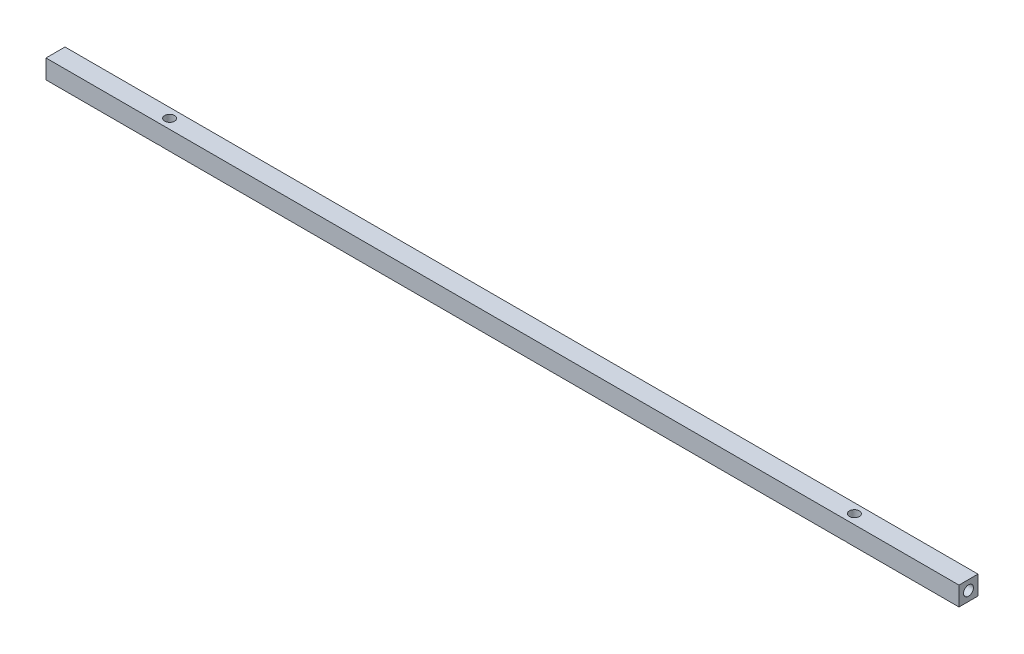
ISO-10303-21;
HEADER;
FILE_DESCRIPTION(('STEP AP214'),'2;1');
FILE_NAME('part.step','',(''),(''),'','','');
FILE_SCHEMA(('AUTOMOTIVE_DESIGN { 1 0 10303 214 1 1 1 1 }'));
ENDSEC;
DATA;
#1=APPLICATION_CONTEXT('core data for automotive mechanical design processes');
#2=APPLICATION_PROTOCOL_DEFINITION('international standard','automotive_design',2000,#1);
#3=PRODUCT_CONTEXT('',#1,'mechanical');
#4=PRODUCT('Part','Part','',(#3));
#5=PRODUCT_RELATED_PRODUCT_CATEGORY('part','',(#4));
#6=PRODUCT_DEFINITION_FORMATION('','',#4);
#7=PRODUCT_DEFINITION_CONTEXT('part definition',#1,'design');
#8=PRODUCT_DEFINITION('design','',#6,#7);
#9=PRODUCT_DEFINITION_SHAPE('','',#8);
#10=(LENGTH_UNIT() NAMED_UNIT(*) SI_UNIT(.MILLI.,.METRE.));
#11=(NAMED_UNIT(*) PLANE_ANGLE_UNIT() SI_UNIT($,.RADIAN.));
#12=(NAMED_UNIT(*) SI_UNIT($,.STERADIAN.) SOLID_ANGLE_UNIT());
#13=UNCERTAINTY_MEASURE_WITH_UNIT(LENGTH_MEASURE(1.E-05),#10,'distance_accuracy_value','');
#14=(GEOMETRIC_REPRESENTATION_CONTEXT(3) GLOBAL_UNCERTAINTY_ASSIGNED_CONTEXT((#13)) GLOBAL_UNIT_ASSIGNED_CONTEXT((#10,
#11,#12)) REPRESENTATION_CONTEXT('',''));
#15=CARTESIAN_POINT('',(0.,0.,0.));
#16=DIRECTION('',(0.,0.,1.));
#17=DIRECTION('',(1.,0.,0.));
#18=AXIS2_PLACEMENT_3D('',#15,#16,#17);
#19=CARTESIAN_POINT('',(152.4,-3.175,3.175));
#20=DIRECTION('',(0.,1.,0.));
#21=DIRECTION('',(0.,0.,1.));
#22=AXIS2_PLACEMENT_3D('',#19,#20,#21);
#23=PLANE('',#22);
#24=DIRECTION('',(-1.,0.,0.));
#25=VECTOR('',#24,1.);
#26=CARTESIAN_POINT('',(152.4,-3.175,3.175));
#27=LINE('',#26,#25);
#28=CARTESIAN_POINT('',(113.661832898059,-3.175,3.175));
#29=VERTEX_POINT('',#28);
#30=CARTESIAN_POINT('',(-113.661832898059,-3.175,3.175));
#31=VERTEX_POINT('',#30);
#32=EDGE_CURVE('E237',#29,#31,#27,.T.);
#33=ORIENTED_EDGE('',*,*,#32,.T.);
#34=CARTESIAN_POINT('',(-114.3,-3.175,0.));
#35=DIRECTION('',(0.,1.,0.));
#36=DIRECTION('',(0.,0.,1.));
#37=AXIS2_PLACEMENT_3D('',#34,#35,#36);
#38=CIRCLE('',#37,3.23850000000005);
#39=CARTESIAN_POINT('',(-113.661832898058,-3.175,-3.175));
#40=VERTEX_POINT('',#39);
#41=EDGE_CURVE('E181',#31,#40,#38,.T.);
#42=ORIENTED_EDGE('',*,*,#41,.T.);
#43=DIRECTION('',(-1.,0.,0.));
#44=VECTOR('',#43,1.);
#45=CARTESIAN_POINT('',(152.4,-3.175,-3.175));
#46=LINE('',#45,#44);
#47=CARTESIAN_POINT('',(113.661832898059,-3.175,-3.175));
#48=VERTEX_POINT('',#47);
#49=EDGE_CURVE('E249',#48,#40,#46,.T.);
#50=ORIENTED_EDGE('',*,*,#49,.F.);
#51=CARTESIAN_POINT('',(114.3,-3.175,0.));
#52=DIRECTION('',(0.,1.,0.));
#53=DIRECTION('',(0.,0.,1.));
#54=AXIS2_PLACEMENT_3D('',#51,#52,#53);
#55=CIRCLE('',#54,3.23850000000003);
#56=EDGE_CURVE('E142',#48,#29,#55,.T.);
#57=ORIENTED_EDGE('',*,*,#56,.T.);
#58=EDGE_LOOP('',(#33,#42,#50,#57));
#59=FACE_BOUND('',#58,.T.);
#60=ADVANCED_FACE('F45',(#59),#23,.F.);
#61=CARTESIAN_POINT('',(152.4,-3.175,3.175));
#62=VERTEX_POINT('',#61);
#63=CARTESIAN_POINT('',(114.938167101941,-3.175,3.175));
#64=VERTEX_POINT('',#63);
#65=EDGE_CURVE('E144',#62,#64,#27,.T.);
#66=ORIENTED_EDGE('',*,*,#65,.T.);
#67=CARTESIAN_POINT('',(114.3,-3.175,0.));
#68=DIRECTION('',(0.,1.,0.));
#69=DIRECTION('',(0.,0.,1.));
#70=AXIS2_PLACEMENT_3D('',#67,#68,#69);
#71=CIRCLE('',#70,3.23850000000003);
#72=CARTESIAN_POINT('',(114.938167101941,-3.175,-3.175));
#73=VERTEX_POINT('',#72);
#74=EDGE_CURVE('E149',#64,#73,#71,.T.);
#75=ORIENTED_EDGE('',*,*,#74,.T.);
#76=CARTESIAN_POINT('',(152.4,-3.175,-3.175));
#77=VERTEX_POINT('',#76);
#78=EDGE_CURVE('E250',#77,#73,#46,.T.);
#79=ORIENTED_EDGE('',*,*,#78,.F.);
#80=DIRECTION('',(0.,0.,-1.));
#81=VECTOR('',#80,1.);
#82=CARTESIAN_POINT('',(152.4,-3.175,3.175));
#83=LINE('',#82,#81);
#84=EDGE_CURVE('E129',#62,#77,#83,.T.);
#85=ORIENTED_EDGE('',*,*,#84,.F.);
#86=EDGE_LOOP('',(#66,#75,#79,#85));
#87=FACE_BOUND('',#86,.T.);
#88=ADVANCED_FACE('F172',(#87),#23,.F.);
#89=CARTESIAN_POINT('',(152.4,-3.175,-3.175));
#90=DIRECTION('',(0.,0.,1.));
#91=DIRECTION('',(1.,0.,0.));
#92=AXIS2_PLACEMENT_3D('',#89,#90,#91);
#93=PLANE('',#92);
#94=ORIENTED_EDGE('',*,*,#49,.T.);
#95=CARTESIAN_POINT('',(-113.661832898059,-3.175,-3.175));
#96=CARTESIAN_POINT('',(-113.741025460393,-3.1593583542426,-3.175));
#97=CARTESIAN_POINT('',(-113.820784696735,-3.14646714727827,-3.175));
#98=CARTESIAN_POINT('',(-113.981060851251,-3.12649774166676,-3.175));
#99=CARTESIAN_POINT('',(-114.061578094226,-3.11942216143955,-3.175));
#100=CARTESIAN_POINT('',(-114.221770085616,-3.11146801445233,-3.175));
#101=CARTESIAN_POINT('',(-114.301440436922,-3.11050236022809,-3.175));
#102=CARTESIAN_POINT('',(-114.460591237594,-3.11456456772639,-3.175));
#103=CARTESIAN_POINT('',(-114.540071760901,-3.11958949187719,-3.175));
#104=CARTESIAN_POINT('',(-114.672614870928,-3.13284849094619,-3.175));
#105=CARTESIAN_POINT('',(-114.725842215316,-3.13950219622169,-3.175));
#106=CARTESIAN_POINT('',(-114.832182991924,-3.15535985143472,-3.175));
#107=CARTESIAN_POINT('',(-114.885294589924,-3.16457613023548,-3.175));
#108=CARTESIAN_POINT('',(-114.938167101941,-3.175,-3.175));
#109=B_SPLINE_CURVE_WITH_KNOTS('',3,(#95,#96,#97,#98,#99,#100,#101,#102,#103,#104,#105,#106,
#107,#108),.UNSPECIFIED.,.F.,.F.,(4,2,2,2,2,2,4),(0.,0.242154451042764,0.484417869750038,
0.723220273510366,0.96190562500867,1.12277374983091,1.28442963777034),.UNSPECIFIED.);
#110=CARTESIAN_POINT('',(-114.938167101941,-3.175,-3.175));
#111=VERTEX_POINT('',#110);
#112=EDGE_CURVE('E175',#40,#111,#109,.T.);
#113=ORIENTED_EDGE('',*,*,#112,.T.);
#114=CARTESIAN_POINT('',(-152.4,-3.175,-3.175));
#115=VERTEX_POINT('',#114);
#116=EDGE_CURVE('E251',#111,#115,#46,.T.);
#117=ORIENTED_EDGE('',*,*,#116,.T.);
#118=DIRECTION('',(0.,1.,0.));
#119=VECTOR('',#118,1.);
#120=CARTESIAN_POINT('',(-152.4,-3.175,-3.175));
#121=LINE('',#120,#119);
#122=CARTESIAN_POINT('',(-152.4,3.175,-3.175));
#123=VERTEX_POINT('',#122);
#124=EDGE_CURVE('E138',#115,#123,#121,.T.);
#125=ORIENTED_EDGE('',*,*,#124,.T.);
#126=DIRECTION('',(-1.,0.,0.));
#127=VECTOR('',#126,1.);
#128=CARTESIAN_POINT('',(152.4,3.175,-3.175));
#129=LINE('',#128,#127);
#130=CARTESIAN_POINT('',(152.4,3.175,-3.175));
#131=VERTEX_POINT('',#130);
#132=EDGE_CURVE('E117',#131,#123,#129,.T.);
#133=ORIENTED_EDGE('',*,*,#132,.F.);
#134=DIRECTION('',(0.,1.,0.));
#135=VECTOR('',#134,1.);
#136=CARTESIAN_POINT('',(152.4,-3.175,-3.175));
#137=LINE('',#136,#135);
#138=EDGE_CURVE('E124',#77,#131,#137,.T.);
#139=ORIENTED_EDGE('',*,*,#138,.F.);
#140=ORIENTED_EDGE('',*,*,#78,.T.);
#141=CARTESIAN_POINT('',(114.938167101941,-3.175,-3.175));
#142=CARTESIAN_POINT('',(114.858974539607,-3.1593583542426,-3.175));
#143=CARTESIAN_POINT('',(114.779215303265,-3.14646714727828,-3.175));
#144=CARTESIAN_POINT('',(114.618939148749,-3.12649774166676,-3.175));
#145=CARTESIAN_POINT('',(114.538421905774,-3.11942216143956,-3.175));
#146=CARTESIAN_POINT('',(114.378229914384,-3.11146801445234,-3.175));
#147=CARTESIAN_POINT('',(114.298559563078,-3.1105023602281,-3.175));
#148=CARTESIAN_POINT('',(114.139408762406,-3.11456456772641,-3.175));
#149=CARTESIAN_POINT('',(114.059928239099,-3.11958949187721,-3.175));
#150=CARTESIAN_POINT('',(113.927385129072,-3.13284849094621,-3.175));
#151=CARTESIAN_POINT('',(113.874157784684,-3.13950219622171,-3.175));
#152=CARTESIAN_POINT('',(113.767817008076,-3.15535985143473,-3.175));
#153=CARTESIAN_POINT('',(113.714705410076,-3.16457613023548,-3.175));
#154=CARTESIAN_POINT('',(113.661832898059,-3.175,-3.175));
#155=B_SPLINE_CURVE_WITH_KNOTS('',3,(#141,#142,#143,#144,#145,#146,#147,#148,#149,#150,#151,
#152,#153,#154),.UNSPECIFIED.,.F.,.F.,(4,2,2,2,2,2,4),(0.,0.242154451042763,0.484417869750037,
0.723220273510379,0.961905625008669,1.12277374983082,1.28442963777017),.UNSPECIFIED.);
#156=EDGE_CURVE('E152',#73,#48,#155,.T.);
#157=ORIENTED_EDGE('',*,*,#156,.T.);
#158=EDGE_LOOP('',(#94,#113,#117,#125,#133,#139,#140,#157));
#159=FACE_BOUND('',#158,.T.);
#160=ADVANCED_FACE('F136',(#159),#93,.F.);
#161=CARTESIAN_POINT('',(152.4,3.175,3.175));
#162=DIRECTION('',(0.,-1.,0.));
#163=DIRECTION('',(0.,0.,-1.));
#164=AXIS2_PLACEMENT_3D('',#161,#162,#163);
#165=PLANE('',#164);
#166=CARTESIAN_POINT('',(-114.3,3.175,0.));
#167=DIRECTION('',(0.,1.,0.));
#168=DIRECTION('',(0.,0.,-1.));
#169=AXIS2_PLACEMENT_3D('',#166,#167,#168);
#170=CIRCLE('',#169,1.65100000000002);
#171=CARTESIAN_POINT('',(-114.3,3.175,-1.65100000000002));
#172=VERTEX_POINT('',#171);
#173=EDGE_CURVE('E277',#172,#172,#170,.T.);
#174=ORIENTED_EDGE('',*,*,#173,.F.);
#175=EDGE_LOOP('',(#174));
#176=FACE_BOUND('',#175,.T.);
#177=CARTESIAN_POINT('',(114.3,3.175,0.));
#178=DIRECTION('',(0.,-1.,0.));
#179=DIRECTION('',(0.,0.,-1.));
#180=AXIS2_PLACEMENT_3D('',#177,#178,#179);
#181=CIRCLE('',#180,1.65100000000002);
#182=CARTESIAN_POINT('',(114.3,3.175,-1.65100000000002));
#183=VERTEX_POINT('',#182);
#184=EDGE_CURVE('E268',#183,#183,#181,.T.);
#185=ORIENTED_EDGE('',*,*,#184,.T.);
#186=EDGE_LOOP('',(#185));
#187=FACE_BOUND('',#186,.T.);
#188=DIRECTION('',(0.,0.,1.));
#189=VECTOR('',#188,1.);
#190=CARTESIAN_POINT('',(-152.4,3.175,3.175));
#191=LINE('',#190,#189);
#192=CARTESIAN_POINT('',(-152.4,3.175,3.175));
#193=VERTEX_POINT('',#192);
#194=EDGE_CURVE('E259',#123,#193,#191,.T.);
#195=ORIENTED_EDGE('',*,*,#194,.T.);
#196=DIRECTION('',(-1.,0.,0.));
#197=VECTOR('',#196,1.);
#198=CARTESIAN_POINT('',(152.4,3.175,3.175));
#199=LINE('',#198,#197);
#200=CARTESIAN_POINT('',(152.4,3.175,3.175));
#201=VERTEX_POINT('',#200);
#202=EDGE_CURVE('E120',#201,#193,#199,.T.);
#203=ORIENTED_EDGE('',*,*,#202,.F.);
#204=DIRECTION('',(0.,0.,1.));
#205=VECTOR('',#204,1.);
#206=CARTESIAN_POINT('',(152.4,3.175,3.175));
#207=LINE('',#206,#205);
#208=EDGE_CURVE('E113',#131,#201,#207,.T.);
#209=ORIENTED_EDGE('',*,*,#208,.F.);
#210=ORIENTED_EDGE('',*,*,#132,.T.);
#211=EDGE_LOOP('',(#195,#203,#209,#210));
#212=FACE_BOUND('',#211,.T.);
#213=ADVANCED_FACE('F115',(#176,#187,#212),#165,.F.);
#214=CARTESIAN_POINT('',(152.4,-3.175,3.175));
#215=DIRECTION('',(0.,0.,-1.));
#216=DIRECTION('',(-1.,0.,0.));
#217=AXIS2_PLACEMENT_3D('',#214,#215,#216);
#218=PLANE('',#217);
#219=CARTESIAN_POINT('',(-114.938167101941,-3.175,3.175));
#220=VERTEX_POINT('',#219);
#221=CARTESIAN_POINT('',(-152.4,-3.175,3.175));
#222=VERTEX_POINT('',#221);
#223=EDGE_CURVE('E242',#220,#222,#27,.T.);
#224=ORIENTED_EDGE('',*,*,#223,.F.);
#225=CARTESIAN_POINT('',(-114.938167101941,-3.175,3.175));
#226=CARTESIAN_POINT('',(-114.858974539607,-3.1593583542426,3.175));
#227=CARTESIAN_POINT('',(-114.779215303265,-3.14646714727827,3.175));
#228=CARTESIAN_POINT('',(-114.618939148749,-3.12649774166676,3.175));
#229=CARTESIAN_POINT('',(-114.538421905774,-3.11942216143955,3.175));
#230=CARTESIAN_POINT('',(-114.378229914384,-3.11146801445233,3.175));
#231=CARTESIAN_POINT('',(-114.298559563078,-3.11050236022809,3.175));
#232=CARTESIAN_POINT('',(-114.139408762406,-3.1145645677264,3.175));
#233=CARTESIAN_POINT('',(-114.059928239099,-3.11958949187719,3.175));
#234=CARTESIAN_POINT('',(-113.927385129072,-3.13284849094619,3.175));
#235=CARTESIAN_POINT('',(-113.874157784684,-3.13950219622169,3.175));
#236=CARTESIAN_POINT('',(-113.767817008076,-3.15535985143472,3.175));
#237=CARTESIAN_POINT('',(-113.714705410076,-3.16457613023548,3.175));
#238=CARTESIAN_POINT('',(-113.661832898059,-3.175,3.175));
#239=B_SPLINE_CURVE_WITH_KNOTS('',3,(#225,#226,#227,#228,#229,#230,#231,#232,#233,#234,#235,
#236,#237,#238),.UNSPECIFIED.,.F.,.F.,(4,2,2,2,2,2,4),(0.,0.242154451042778,0.484417869750038,
0.72322027351038,0.961905625008669,1.12277374983089,1.28442963777031),.UNSPECIFIED.);
#240=EDGE_CURVE('E55',#220,#31,#239,.T.);
#241=ORIENTED_EDGE('',*,*,#240,.T.);
#242=ORIENTED_EDGE('',*,*,#32,.F.);
#243=CARTESIAN_POINT('',(113.661832898059,-3.175,3.175));
#244=CARTESIAN_POINT('',(113.741025460393,-3.1593583542426,3.175));
#245=CARTESIAN_POINT('',(113.820784696735,-3.14646714727828,3.175));
#246=CARTESIAN_POINT('',(113.981060851251,-3.12649774166676,3.175));
#247=CARTESIAN_POINT('',(114.061578094226,-3.11942216143956,3.175));
#248=CARTESIAN_POINT('',(114.221770085616,-3.11146801445234,3.175));
#249=CARTESIAN_POINT('',(114.301440436922,-3.1105023602281,3.175));
#250=CARTESIAN_POINT('',(114.460591237594,-3.11456456772641,3.175));
#251=CARTESIAN_POINT('',(114.540071760901,-3.11958949187721,3.175));
#252=CARTESIAN_POINT('',(114.672614870928,-3.13284849094621,3.175));
#253=CARTESIAN_POINT('',(114.725842215316,-3.13950219622171,3.175));
#254=CARTESIAN_POINT('',(114.832182991924,-3.15535985143473,3.175));
#255=CARTESIAN_POINT('',(114.885294589924,-3.16457613023549,3.175));
#256=CARTESIAN_POINT('',(114.938167101941,-3.175,3.175));
#257=B_SPLINE_CURVE_WITH_KNOTS('',3,(#243,#244,#245,#246,#247,#248,#249,#250,#251,#252,#253,
#254,#255,#256),.UNSPECIFIED.,.F.,.F.,(4,2,2,2,2,2,4),(0.,0.242154451042777,0.484417869750037,
0.723220273510351,0.961905625008668,1.12277374983081,1.28442963777014),.UNSPECIFIED.);
#258=EDGE_CURVE('E159',#29,#64,#257,.T.);
#259=ORIENTED_EDGE('',*,*,#258,.T.);
#260=ORIENTED_EDGE('',*,*,#65,.F.);
#261=DIRECTION('',(0.,-1.,0.));
#262=VECTOR('',#261,1.);
#263=CARTESIAN_POINT('',(152.4,-3.175,3.175));
#264=LINE('',#263,#262);
#265=EDGE_CURVE('E123',#201,#62,#264,.T.);
#266=ORIENTED_EDGE('',*,*,#265,.F.);
#267=ORIENTED_EDGE('',*,*,#202,.T.);
#268=DIRECTION('',(0.,-1.,0.));
#269=VECTOR('',#268,1.);
#270=CARTESIAN_POINT('',(-152.4,-3.175,3.175));
#271=LINE('',#270,#269);
#272=EDGE_CURVE('E256',#193,#222,#271,.T.);
#273=ORIENTED_EDGE('',*,*,#272,.T.);
#274=EDGE_LOOP('',(#224,#241,#242,#259,#260,#266,#267,#273));
#275=FACE_BOUND('',#274,.T.);
#276=ADVANCED_FACE('F186',(#275),#218,.F.);
#277=ORIENTED_EDGE('',*,*,#116,.F.);
#278=CARTESIAN_POINT('',(-114.3,-3.175,0.));
#279=DIRECTION('',(0.,1.,0.));
#280=DIRECTION('',(0.,0.,1.));
#281=AXIS2_PLACEMENT_3D('',#278,#279,#280);
#282=CIRCLE('',#281,3.23850000000005);
#283=EDGE_CURVE('E62',#111,#220,#282,.T.);
#284=ORIENTED_EDGE('',*,*,#283,.T.);
#285=ORIENTED_EDGE('',*,*,#223,.T.);
#286=DIRECTION('',(0.,0.,-1.));
#287=VECTOR('',#286,1.);
#288=CARTESIAN_POINT('',(-152.4,-3.175,3.175));
#289=LINE('',#288,#287);
#290=EDGE_CURVE('E133',#222,#115,#289,.T.);
#291=ORIENTED_EDGE('',*,*,#290,.T.);
#292=EDGE_LOOP('',(#277,#284,#285,#291));
#293=FACE_BOUND('',#292,.T.);
#294=ADVANCED_FACE('F190',(#293),#23,.F.);
#295=CARTESIAN_POINT('',(152.4,0.,0.));
#296=DIRECTION('',(-1.,0.,0.));
#297=DIRECTION('',(0.,0.,1.));
#298=AXIS2_PLACEMENT_3D('',#295,#296,#297);
#299=PLANE('',#298);
#300=CARTESIAN_POINT('',(152.4,0.,0.));
#301=DIRECTION('',(1.,0.,0.));
#302=DIRECTION('',(0.,0.,-1.));
#303=AXIS2_PLACEMENT_3D('',#300,#301,#302);
#304=CIRCLE('',#303,1.651);
#305=CARTESIAN_POINT('',(152.4,0.,-1.651));
#306=VERTEX_POINT('',#305);
#307=EDGE_CURVE('E265',#306,#306,#304,.T.);
#308=ORIENTED_EDGE('',*,*,#307,.F.);
#309=EDGE_LOOP('',(#308));
#310=FACE_BOUND('',#309,.T.);
#311=ORIENTED_EDGE('',*,*,#138,.T.);
#312=ORIENTED_EDGE('',*,*,#208,.T.);
#313=ORIENTED_EDGE('',*,*,#265,.T.);
#314=ORIENTED_EDGE('',*,*,#84,.T.);
#315=EDGE_LOOP('',(#311,#312,#313,#314));
#316=FACE_BOUND('',#315,.T.);
#317=ADVANCED_FACE('F127',(#310,#316),#299,.F.);
#318=CARTESIAN_POINT('',(-152.4,0.,0.));
#319=DIRECTION('',(-1.,0.,0.));
#320=DIRECTION('',(0.,0.,1.));
#321=AXIS2_PLACEMENT_3D('',#318,#319,#320);
#322=PLANE('',#321);
#323=CARTESIAN_POINT('',(-152.4,0.,0.));
#324=DIRECTION('',(1.,0.,0.));
#325=DIRECTION('',(0.,0.,-1.));
#326=AXIS2_PLACEMENT_3D('',#323,#324,#325);
#327=CIRCLE('',#326,1.651);
#328=CARTESIAN_POINT('',(-152.4,0.,1.651));
#329=VERTEX_POINT('',#328);
#330=EDGE_CURVE('E274',#329,#329,#327,.T.);
#331=ORIENTED_EDGE('',*,*,#330,.T.);
#332=EDGE_LOOP('',(#331));
#333=FACE_BOUND('',#332,.T.);
#334=ORIENTED_EDGE('',*,*,#124,.F.);
#335=ORIENTED_EDGE('',*,*,#290,.F.);
#336=ORIENTED_EDGE('',*,*,#272,.F.);
#337=ORIENTED_EDGE('',*,*,#194,.F.);
#338=EDGE_LOOP('',(#334,#335,#336,#337));
#339=FACE_BOUND('',#338,.T.);
#340=ADVANCED_FACE('F194',(#333,#339),#322,.T.);
#341=CARTESIAN_POINT('',(133.35,0.,0.));
#342=DIRECTION('',(1.,0.,0.));
#343=DIRECTION('',(0.,0.,-1.));
#344=AXIS2_PLACEMENT_3D('',#341,#342,#343);
#345=CYLINDRICAL_SURFACE('',#344,1.651);
#346=CARTESIAN_POINT('',(133.35,0.,0.));
#347=DIRECTION('',(1.,0.,0.));
#348=DIRECTION('',(0.,0.,-1.));
#349=AXIS2_PLACEMENT_3D('',#346,#347,#348);
#350=CIRCLE('',#349,1.651);
#351=CARTESIAN_POINT('',(133.35,0.,-1.651));
#352=VERTEX_POINT('',#351);
#353=EDGE_CURVE('E262',#352,#352,#350,.T.);
#354=CARTESIAN_POINT('',(133.35,0.,-1.651));
#355=CARTESIAN_POINT('',(133.5484375,0.,-1.651));
#356=CARTESIAN_POINT('',(133.746875,0.,-1.651));
#357=CARTESIAN_POINT('',(134.14375,0.,-1.651));
#358=CARTESIAN_POINT('',(134.3421875,0.,-1.651));
#359=CARTESIAN_POINT('',(134.7390625,0.,-1.651));
#360=CARTESIAN_POINT('',(134.9375,0.,-1.651));
#361=CARTESIAN_POINT('',(135.334375,0.,-1.651));
#362=CARTESIAN_POINT('',(135.5328125,0.,-1.651));
#363=CARTESIAN_POINT('',(135.9296875,0.,-1.651));
#364=CARTESIAN_POINT('',(136.128125,0.,-1.651));
#365=CARTESIAN_POINT('',(136.525,0.,-1.651));
#366=CARTESIAN_POINT('',(136.7234375,0.,-1.651));
#367=CARTESIAN_POINT('',(137.1203125,0.,-1.651));
#368=CARTESIAN_POINT('',(137.31875,0.,-1.651));
#369=CARTESIAN_POINT('',(137.715625,0.,-1.651));
#370=CARTESIAN_POINT('',(137.9140625,0.,-1.651));
#371=CARTESIAN_POINT('',(138.3109375,0.,-1.651));
#372=CARTESIAN_POINT('',(138.509375,0.,-1.651));
#373=CARTESIAN_POINT('',(138.90625,0.,-1.651));
#374=CARTESIAN_POINT('',(139.1046875,0.,-1.651));
#375=CARTESIAN_POINT('',(139.5015625,0.,-1.651));
#376=CARTESIAN_POINT('',(139.7,0.,-1.651));
#377=CARTESIAN_POINT('',(140.096875,0.,-1.651));
#378=CARTESIAN_POINT('',(140.2953125,0.,-1.651));
#379=CARTESIAN_POINT('',(140.6921875,0.,-1.651));
#380=CARTESIAN_POINT('',(140.890625,0.,-1.651));
#381=CARTESIAN_POINT('',(141.2875,0.,-1.651));
#382=CARTESIAN_POINT('',(141.4859375,0.,-1.651));
#383=CARTESIAN_POINT('',(141.8828125,0.,-1.651));
#384=CARTESIAN_POINT('',(142.08125,0.,-1.651));
#385=CARTESIAN_POINT('',(142.478125,0.,-1.651));
#386=CARTESIAN_POINT('',(142.6765625,0.,-1.651));
#387=CARTESIAN_POINT('',(143.0734375,0.,-1.651));
#388=CARTESIAN_POINT('',(143.271875,0.,-1.651));
#389=CARTESIAN_POINT('',(143.66875,0.,-1.651));
#390=CARTESIAN_POINT('',(143.8671875,0.,-1.651));
#391=CARTESIAN_POINT('',(144.2640625,0.,-1.651));
#392=CARTESIAN_POINT('',(144.4625,0.,-1.651));
#393=CARTESIAN_POINT('',(144.859375,0.,-1.651));
#394=CARTESIAN_POINT('',(145.0578125,0.,-1.651));
#395=CARTESIAN_POINT('',(145.4546875,0.,-1.651));
#396=CARTESIAN_POINT('',(145.653125,0.,-1.651));
#397=CARTESIAN_POINT('',(146.05,0.,-1.651));
#398=CARTESIAN_POINT('',(146.2484375,0.,-1.651));
#399=CARTESIAN_POINT('',(146.6453125,0.,-1.651));
#400=CARTESIAN_POINT('',(146.84375,0.,-1.651));
#401=CARTESIAN_POINT('',(147.240625,0.,-1.651));
#402=CARTESIAN_POINT('',(147.4390625,0.,-1.651));
#403=CARTESIAN_POINT('',(147.8359375,0.,-1.651));
#404=CARTESIAN_POINT('',(148.034375,0.,-1.651));
#405=CARTESIAN_POINT('',(148.43125,0.,-1.651));
#406=CARTESIAN_POINT('',(148.6296875,0.,-1.651));
#407=CARTESIAN_POINT('',(149.0265625,0.,-1.651));
#408=CARTESIAN_POINT('',(149.225,0.,-1.651));
#409=CARTESIAN_POINT('',(149.621875,0.,-1.651));
#410=CARTESIAN_POINT('',(149.8203125,0.,-1.651));
#411=CARTESIAN_POINT('',(150.2171875,0.,-1.651));
#412=CARTESIAN_POINT('',(150.415625,0.,-1.651));
#413=CARTESIAN_POINT('',(150.8125,0.,-1.651));
#414=CARTESIAN_POINT('',(151.0109375,0.,-1.651));
#415=CARTESIAN_POINT('',(151.4078125,0.,-1.651));
#416=CARTESIAN_POINT('',(151.60625,0.,-1.651));
#417=CARTESIAN_POINT('',(152.003125,0.,-1.651));
#418=CARTESIAN_POINT('',(152.2015625,0.,-1.651));
#419=CARTESIAN_POINT('',(152.4,0.,-1.651));
#420=B_SPLINE_CURVE_WITH_KNOTS('',3,(#354,#355,#356,#357,#358,#359,#360,#361,#362,#363,#364,
#365,#366,#367,#368,#369,#370,#371,#372,#373,#374,#375,#376,#377,#378,#379,#380,#381,#382,#383,
#384,#385,#386,#387,#388,#389,#390,#391,#392,#393,#394,#395,#396,#397,#398,#399,#400,#401,#402,
#403,#404,#405,#406,#407,#408,#409,#410,#411,#412,#413,#414,#415,#416,#417,#418,#419),
.UNSPECIFIED.,.F.,.F.,(4,2,2,2,2,2,2,2,2,2,2,2,2,2,2,2,2,2,2,2,2,2,2,2,2,2,2,2,2,2,2,2,4),(0.,
0.595312500000028,1.19062500000003,1.78593750000003,2.38125000000003,2.97656250000003,
3.57187500000003,4.16718750000003,4.76250000000003,5.35781250000003,5.95312500000003,
6.54843750000003,7.14375000000003,7.73906250000003,8.33437500000003,8.92968750000003,
9.52500000000003,10.1203125,10.715625,11.3109375,11.90625,12.5015625,13.096875,13.6921875,
14.2875,14.8828125,15.478125,16.0734375,16.66875,17.2640625,17.859375,18.4546875,19.05),.UNSPECIFIED.);
#421=EDGE_CURVE('BSEAM197',#352,#306,#420,.T.);
#422=ORIENTED_EDGE('',*,*,#353,.F.);
#423=ORIENTED_EDGE('',*,*,#307,.T.);
#424=ORIENTED_EDGE('',*,*,#421,.T.);
#425=ORIENTED_EDGE('',*,*,#421,.F.);
#426=EDGE_LOOP('',(#422,#424,#423,#425));
#427=FACE_BOUND('',#426,.T.);
#428=ADVANCED_FACE('F197',(#427),#345,.F.);
#429=CARTESIAN_POINT('',(133.35,0.,0.));
#430=DIRECTION('',(1.,0.,0.));
#431=DIRECTION('',(0.,0.,-1.));
#432=AXIS2_PLACEMENT_3D('',#429,#430,#431);
#433=PLANE('',#432);
#434=ORIENTED_EDGE('',*,*,#353,.T.);
#435=EDGE_LOOP('',(#434));
#436=FACE_BOUND('',#435,.T.);
#437=ADVANCED_FACE('F204',(#436),#433,.T.);
#438=CARTESIAN_POINT('',(114.3,3.175,0.));
#439=DIRECTION('',(0.,-1.,0.));
#440=DIRECTION('',(0.,0.,-1.));
#441=AXIS2_PLACEMENT_3D('',#438,#439,#440);
#442=CYLINDRICAL_SURFACE('',#441,1.65100000000002);
#443=CARTESIAN_POINT('',(114.3,-1.58749999999997,0.));
#444=DIRECTION('',(0.,1.,0.));
#445=DIRECTION('',(0.,0.,1.));
#446=AXIS2_PLACEMENT_3D('',#443,#444,#445);
#447=CIRCLE('',#446,1.65100000000002);
#448=CARTESIAN_POINT('',(114.3,-1.58749999999997,1.65100000000002));
#449=VERTEX_POINT('',#448);
#450=EDGE_CURVE('E139',#449,#449,#447,.F.);
#451=ORIENTED_EDGE('',*,*,#450,.T.);
#452=EDGE_LOOP('',(#451));
#453=FACE_BOUND('',#452,.T.);
#454=ORIENTED_EDGE('',*,*,#184,.F.);
#455=EDGE_LOOP('',(#454));
#456=FACE_BOUND('',#455,.T.);
#457=ADVANCED_FACE('F208',(#453,#456),#442,.F.);
#458=CARTESIAN_POINT('',(114.3,-1.58749999999997,0.));
#459=DIRECTION('',(0.,-1.,0.));
#460=DIRECTION('',(0.,0.,-1.));
#461=AXIS2_PLACEMENT_3D('',#458,#459,#460);
#462=CONICAL_SURFACE('',#461,1.65100000000002,0.785398163397443);
#463=ORIENTED_EDGE('',*,*,#156,.F.);
#464=ORIENTED_EDGE('',*,*,#74,.F.);
#465=ORIENTED_EDGE('',*,*,#258,.F.);
#466=ORIENTED_EDGE('',*,*,#56,.F.);
#467=EDGE_LOOP('',(#463,#464,#465,#466));
#468=FACE_BOUND('',#467,.T.);
#469=ORIENTED_EDGE('',*,*,#450,.F.);
#470=EDGE_LOOP('',(#469));
#471=FACE_BOUND('',#470,.T.);
#472=ADVANCED_FACE('F167',(#468,#471),#462,.F.);
#473=CARTESIAN_POINT('',(-133.35,0.,0.));
#474=DIRECTION('',(-1.,0.,0.));
#475=DIRECTION('',(0.,0.,1.));
#476=AXIS2_PLACEMENT_3D('',#473,#474,#475);
#477=CYLINDRICAL_SURFACE('',#476,1.651);
#478=CARTESIAN_POINT('',(-133.35,0.,0.));
#479=DIRECTION('',(1.,0.,0.));
#480=DIRECTION('',(0.,0.,-1.));
#481=AXIS2_PLACEMENT_3D('',#478,#479,#480);
#482=CIRCLE('',#481,1.651);
#483=CARTESIAN_POINT('',(-133.35,0.,1.651));
#484=VERTEX_POINT('',#483);
#485=EDGE_CURVE('E273',#484,#484,#482,.T.);
#486=CARTESIAN_POINT('',(-133.35,0.,1.651));
#487=CARTESIAN_POINT('',(-133.5484375,0.,1.651));
#488=CARTESIAN_POINT('',(-133.746875,0.,1.651));
#489=CARTESIAN_POINT('',(-134.14375,0.,1.651));
#490=CARTESIAN_POINT('',(-134.3421875,0.,1.651));
#491=CARTESIAN_POINT('',(-134.7390625,0.,1.651));
#492=CARTESIAN_POINT('',(-134.9375,0.,1.651));
#493=CARTESIAN_POINT('',(-135.334375,0.,1.651));
#494=CARTESIAN_POINT('',(-135.5328125,0.,1.651));
#495=CARTESIAN_POINT('',(-135.9296875,0.,1.651));
#496=CARTESIAN_POINT('',(-136.128125,0.,1.651));
#497=CARTESIAN_POINT('',(-136.525,0.,1.651));
#498=CARTESIAN_POINT('',(-136.7234375,0.,1.651));
#499=CARTESIAN_POINT('',(-137.1203125,0.,1.651));
#500=CARTESIAN_POINT('',(-137.31875,0.,1.651));
#501=CARTESIAN_POINT('',(-137.715625,0.,1.651));
#502=CARTESIAN_POINT('',(-137.9140625,0.,1.651));
#503=CARTESIAN_POINT('',(-138.3109375,0.,1.651));
#504=CARTESIAN_POINT('',(-138.509375,0.,1.651));
#505=CARTESIAN_POINT('',(-138.90625,0.,1.651));
#506=CARTESIAN_POINT('',(-139.1046875,0.,1.651));
#507=CARTESIAN_POINT('',(-139.5015625,0.,1.651));
#508=CARTESIAN_POINT('',(-139.7,0.,1.651));
#509=CARTESIAN_POINT('',(-140.096875,0.,1.651));
#510=CARTESIAN_POINT('',(-140.2953125,0.,1.651));
#511=CARTESIAN_POINT('',(-140.6921875,0.,1.651));
#512=CARTESIAN_POINT('',(-140.890625,0.,1.651));
#513=CARTESIAN_POINT('',(-141.2875,0.,1.651));
#514=CARTESIAN_POINT('',(-141.4859375,0.,1.651));
#515=CARTESIAN_POINT('',(-141.8828125,0.,1.651));
#516=CARTESIAN_POINT('',(-142.08125,0.,1.651));
#517=CARTESIAN_POINT('',(-142.478125,0.,1.651));
#518=CARTESIAN_POINT('',(-142.6765625,0.,1.651));
#519=CARTESIAN_POINT('',(-143.0734375,0.,1.651));
#520=CARTESIAN_POINT('',(-143.271875,0.,1.651));
#521=CARTESIAN_POINT('',(-143.66875,0.,1.651));
#522=CARTESIAN_POINT('',(-143.8671875,0.,1.651));
#523=CARTESIAN_POINT('',(-144.2640625,0.,1.651));
#524=CARTESIAN_POINT('',(-144.4625,0.,1.651));
#525=CARTESIAN_POINT('',(-144.859375,0.,1.651));
#526=CARTESIAN_POINT('',(-145.0578125,0.,1.651));
#527=CARTESIAN_POINT('',(-145.4546875,0.,1.651));
#528=CARTESIAN_POINT('',(-145.653125,0.,1.651));
#529=CARTESIAN_POINT('',(-146.05,0.,1.651));
#530=CARTESIAN_POINT('',(-146.2484375,0.,1.651));
#531=CARTESIAN_POINT('',(-146.6453125,0.,1.651));
#532=CARTESIAN_POINT('',(-146.84375,0.,1.651));
#533=CARTESIAN_POINT('',(-147.240625,0.,1.651));
#534=CARTESIAN_POINT('',(-147.4390625,0.,1.651));
#535=CARTESIAN_POINT('',(-147.8359375,0.,1.651));
#536=CARTESIAN_POINT('',(-148.034375,0.,1.651));
#537=CARTESIAN_POINT('',(-148.43125,0.,1.651));
#538=CARTESIAN_POINT('',(-148.6296875,0.,1.651));
#539=CARTESIAN_POINT('',(-149.0265625,0.,1.651));
#540=CARTESIAN_POINT('',(-149.225,0.,1.651));
#541=CARTESIAN_POINT('',(-149.621875,0.,1.651));
#542=CARTESIAN_POINT('',(-149.8203125,0.,1.651));
#543=CARTESIAN_POINT('',(-150.2171875,0.,1.651));
#544=CARTESIAN_POINT('',(-150.415625,0.,1.651));
#545=CARTESIAN_POINT('',(-150.8125,0.,1.651));
#546=CARTESIAN_POINT('',(-151.0109375,0.,1.651));
#547=CARTESIAN_POINT('',(-151.4078125,0.,1.651));
#548=CARTESIAN_POINT('',(-151.60625,0.,1.651));
#549=CARTESIAN_POINT('',(-152.003125,0.,1.651));
#550=CARTESIAN_POINT('',(-152.2015625,0.,1.651));
#551=CARTESIAN_POINT('',(-152.4,0.,1.651));
#552=B_SPLINE_CURVE_WITH_KNOTS('',3,(#486,#487,#488,#489,#490,#491,#492,#493,#494,#495,#496,
#497,#498,#499,#500,#501,#502,#503,#504,#505,#506,#507,#508,#509,#510,#511,#512,#513,#514,#515,
#516,#517,#518,#519,#520,#521,#522,#523,#524,#525,#526,#527,#528,#529,#530,#531,#532,#533,#534,
#535,#536,#537,#538,#539,#540,#541,#542,#543,#544,#545,#546,#547,#548,#549,#550,#551),
.UNSPECIFIED.,.F.,.F.,(4,2,2,2,2,2,2,2,2,2,2,2,2,2,2,2,2,2,2,2,2,2,2,2,2,2,2,2,2,2,2,2,4),(0.,
0.5953125,1.190625,1.7859375,2.38125,2.9765625,3.571875,4.1671875,4.7625,5.3578125,5.953125,
6.5484375,7.14375,7.7390625,8.334375,8.92968750000001,9.52500000000001,10.1203125,10.715625,
11.3109375,11.90625,12.5015625,13.096875,13.6921875,14.2875,14.8828125,15.478125,16.0734375,
16.66875,17.2640625,17.859375,18.4546875,19.05),.UNSPECIFIED.);
#553=EDGE_CURVE('BSEAM213',#484,#329,#552,.T.);
#554=ORIENTED_EDGE('',*,*,#485,.T.);
#555=ORIENTED_EDGE('',*,*,#330,.F.);
#556=ORIENTED_EDGE('',*,*,#553,.T.);
#557=ORIENTED_EDGE('',*,*,#553,.F.);
#558=EDGE_LOOP('',(#554,#556,#555,#557));
#559=FACE_BOUND('',#558,.T.);
#560=ADVANCED_FACE('F213',(#559),#477,.F.);
#561=CARTESIAN_POINT('',(-133.35,0.,0.));
#562=DIRECTION('',(-1.,0.,0.));
#563=DIRECTION('',(0.,0.,-1.));
#564=AXIS2_PLACEMENT_3D('',#561,#562,#563);
#565=PLANE('',#564);
#566=ORIENTED_EDGE('',*,*,#485,.F.);
#567=EDGE_LOOP('',(#566));
#568=FACE_BOUND('',#567,.T.);
#569=ADVANCED_FACE('F216',(#568),#565,.T.);
#570=CARTESIAN_POINT('',(-114.3,3.175,0.));
#571=DIRECTION('',(0.,-1.,0.));
#572=DIRECTION('',(0.,0.,-1.));
#573=AXIS2_PLACEMENT_3D('',#570,#571,#572);
#574=CYLINDRICAL_SURFACE('',#573,1.65100000000002);
#575=CARTESIAN_POINT('',(-114.3,-1.58749999999999,0.));
#576=DIRECTION('',(0.,1.,0.));
#577=DIRECTION('',(0.,0.,1.));
#578=AXIS2_PLACEMENT_3D('',#575,#576,#577);
#579=CIRCLE('',#578,1.65100000000002);
#580=CARTESIAN_POINT('',(-114.3,-1.58749999999999,1.65100000000002));
#581=VERTEX_POINT('',#580);
#582=EDGE_CURVE('E11',#581,#581,#579,.F.);
#583=ORIENTED_EDGE('',*,*,#582,.T.);
#584=EDGE_LOOP('',(#583));
#585=FACE_BOUND('',#584,.T.);
#586=ORIENTED_EDGE('',*,*,#173,.T.);
#587=EDGE_LOOP('',(#586));
#588=FACE_BOUND('',#587,.T.);
#589=ADVANCED_FACE('F220',(#585,#588),#574,.F.);
#590=CARTESIAN_POINT('',(-114.3,-3.175,0.));
#591=DIRECTION('',(0.,-1.,0.));
#592=DIRECTION('',(0.,0.,-1.));
#593=AXIS2_PLACEMENT_3D('',#590,#591,#592);
#594=CONICAL_SURFACE('',#593,3.23850000000005,0.785398163397454);
#595=ORIENTED_EDGE('',*,*,#582,.F.);
#596=EDGE_LOOP('',(#595));
#597=FACE_BOUND('',#596,.T.);
#598=ORIENTED_EDGE('',*,*,#112,.F.);
#599=ORIENTED_EDGE('',*,*,#41,.F.);
#600=ORIENTED_EDGE('',*,*,#240,.F.);
#601=ORIENTED_EDGE('',*,*,#283,.F.);
#602=EDGE_LOOP('',(#598,#599,#600,#601));
#603=FACE_BOUND('',#602,.T.);
#604=ADVANCED_FACE('F48',(#597,#603),#594,.F.);
#605=CLOSED_SHELL('',(#60,#88,#160,#213,#276,#294,#317,#340,#428,#437,#457,#472,#560,#569,#589,#604));
#606=MANIFOLD_SOLID_BREP('B2',#605);
#607=ADVANCED_BREP_SHAPE_REPRESENTATION('',(#18,#606),#14);
#608=SHAPE_DEFINITION_REPRESENTATION(#9,#607);
ENDSEC;
END-ISO-10303-21;
